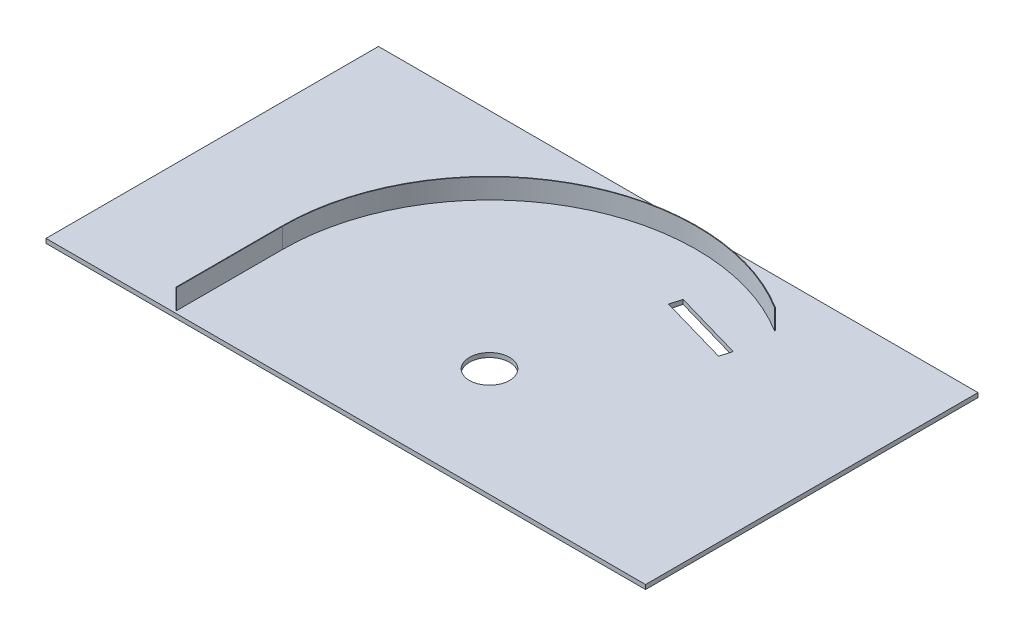
ISO-10303-21;
HEADER;
FILE_DESCRIPTION(('STEP AP214'),'2;1');
FILE_NAME('part.step','',(''),(''),'','','');
FILE_SCHEMA(('AUTOMOTIVE_DESIGN { 1 0 10303 214 1 1 1 1 }'));
ENDSEC;
DATA;
#1=APPLICATION_CONTEXT('core data for automotive mechanical design processes');
#2=APPLICATION_PROTOCOL_DEFINITION('international standard','automotive_design',2000,#1);
#3=PRODUCT_CONTEXT('',#1,'mechanical');
#4=PRODUCT('Part','Part','',(#3));
#5=PRODUCT_RELATED_PRODUCT_CATEGORY('part','',(#4));
#6=PRODUCT_DEFINITION_FORMATION('','',#4);
#7=PRODUCT_DEFINITION_CONTEXT('part definition',#1,'design');
#8=PRODUCT_DEFINITION('design','',#6,#7);
#9=PRODUCT_DEFINITION_SHAPE('','',#8);
#10=(LENGTH_UNIT() NAMED_UNIT(*) SI_UNIT(.MILLI.,.METRE.));
#11=(NAMED_UNIT(*) PLANE_ANGLE_UNIT() SI_UNIT($,.RADIAN.));
#12=(NAMED_UNIT(*) SI_UNIT($,.STERADIAN.) SOLID_ANGLE_UNIT());
#13=UNCERTAINTY_MEASURE_WITH_UNIT(LENGTH_MEASURE(1.E-05),#10,'distance_accuracy_value','');
#14=(GEOMETRIC_REPRESENTATION_CONTEXT(3) GLOBAL_UNCERTAINTY_ASSIGNED_CONTEXT((#13)) GLOBAL_UNIT_ASSIGNED_CONTEXT((#10,
#11,#12)) REPRESENTATION_CONTEXT('',''));
#15=CARTESIAN_POINT('',(0.,0.,0.));
#16=DIRECTION('',(0.,0.,1.));
#17=DIRECTION('',(1.,0.,0.));
#18=AXIS2_PLACEMENT_3D('',#15,#16,#17);
#19=CARTESIAN_POINT('',(0.,0.,0.));
#20=DIRECTION('',(0.,1.,0.));
#21=DIRECTION('',(0.,0.,1.));
#22=AXIS2_PLACEMENT_3D('',#19,#20,#21);
#23=PLANE('',#22);
#24=DIRECTION('',(0.275637355816992,0.,-0.961261695938321));
#25=VECTOR('',#24,1.);
#26=CARTESIAN_POINT('',(262.4,0.,-317.9));
#27=LINE('',#26,#25);
#28=CARTESIAN_POINT('',(262.4,0.,-317.9));
#29=VERTEX_POINT('',#28);
#30=CARTESIAN_POINT('',(270.66912067451,0.,-346.737850878149));
#31=VERTEX_POINT('',#30);
#32=EDGE_CURVE('E57',#29,#31,#27,.T.);
#33=ORIENTED_EDGE('',*,*,#32,.F.);
#34=DIRECTION('',(0.961261695938321,0.,0.275637355816993));
#35=VECTOR('',#34,1.);
#36=CARTESIAN_POINT('',(84.5665862514106,0.,-368.892910826144));
#37=LINE('',#36,#35);
#38=CARTESIAN_POINT('',(84.5665862514106,0.,-368.892910826144));
#39=VERTEX_POINT('',#38);
#40=EDGE_CURVE('E161',#39,#29,#37,.T.);
#41=ORIENTED_EDGE('',*,*,#40,.F.);
#42=DIRECTION('',(-0.275637355816993,0.,0.961261695938321));
#43=VECTOR('',#42,1.);
#44=CARTESIAN_POINT('',(92.8357069259204,0.,-397.730761704293));
#45=LINE('',#44,#43);
#46=CARTESIAN_POINT('',(92.8357069259204,0.,-397.730761704293));
#47=VERTEX_POINT('',#46);
#48=EDGE_CURVE('E164',#47,#39,#45,.T.);
#49=ORIENTED_EDGE('',*,*,#48,.F.);
#50=DIRECTION('',(-0.961261695938321,0.,-0.275637355816993));
#51=VECTOR('',#50,1.);
#52=CARTESIAN_POINT('',(270.66912067451,0.,-346.73785087815));
#53=LINE('',#52,#51);
#54=EDGE_CURVE('E170',#31,#47,#53,.T.);
#55=ORIENTED_EDGE('',*,*,#54,.F.);
#56=EDGE_LOOP('',(#33,#41,#49,#55));
#57=FACE_BOUND('',#56,.T.);
#58=CARTESIAN_POINT('',(0.,0.,0.));
#59=DIRECTION('',(0.,1.,0.));
#60=DIRECTION('',(0.,0.,1.));
#61=AXIS2_PLACEMENT_3D('',#58,#59,#60);
#62=CIRCLE('',#61,50.8);
#63=CARTESIAN_POINT('',(0.,0.,50.8));
#64=VERTEX_POINT('',#63);
#65=EDGE_CURVE('E183',#64,#64,#62,.T.);
#66=ORIENTED_EDGE('',*,*,#65,.F.);
#67=EDGE_LOOP('',(#66));
#68=FACE_BOUND('',#67,.T.);
#69=DIRECTION('',(0.,0.,1.));
#70=VECTOR('',#69,1.);
#71=CARTESIAN_POINT('',(-848.,0.,-566.7));
#72=LINE('',#71,#70);
#73=CARTESIAN_POINT('',(-848.,0.,-566.7));
#74=VERTEX_POINT('',#73);
#75=CARTESIAN_POINT('',(-848.,0.,275.4));
#76=VERTEX_POINT('',#75);
#77=EDGE_CURVE('E208',#74,#76,#72,.T.);
#78=ORIENTED_EDGE('',*,*,#77,.T.);
#79=DIRECTION('',(1.,0.,0.));
#80=VECTOR('',#79,1.);
#81=CARTESIAN_POINT('',(-848.,0.,275.4));
#82=LINE('',#81,#80);
#83=CARTESIAN_POINT('',(670.677694458201,0.,275.4));
#84=VERTEX_POINT('',#83);
#85=EDGE_CURVE('E225',#76,#84,#82,.T.);
#86=ORIENTED_EDGE('',*,*,#85,.T.);
#87=DIRECTION('',(0.,0.,-1.));
#88=VECTOR('',#87,1.);
#89=CARTESIAN_POINT('',(670.677694458201,0.,-566.7));
#90=LINE('',#89,#88);
#91=CARTESIAN_POINT('',(670.677694458201,0.,-566.7));
#92=VERTEX_POINT('',#91);
#93=EDGE_CURVE('E228',#84,#92,#90,.T.);
#94=ORIENTED_EDGE('',*,*,#93,.T.);
#95=DIRECTION('',(-1.,0.,0.));
#96=VECTOR('',#95,1.);
#97=CARTESIAN_POINT('',(-848.,0.,-566.7));
#98=LINE('',#97,#96);
#99=EDGE_CURVE('E213',#92,#74,#98,.T.);
#100=ORIENTED_EDGE('',*,*,#99,.T.);
#101=EDGE_LOOP('',(#78,#86,#94,#100));
#102=FACE_BOUND('',#101,.T.);
#103=DIRECTION('',(1.,0.,0.));
#104=VECTOR('',#103,1.);
#105=CARTESIAN_POINT('',(-525.5875,0.,269.05));
#106=LINE('',#105,#104);
#107=CARTESIAN_POINT('',(-525.5875,0.,269.05));
#108=VERTEX_POINT('',#107);
#109=CARTESIAN_POINT('',(-524.,0.,269.05));
#110=VERTEX_POINT('',#109);
#111=EDGE_CURVE('E184',#108,#110,#106,.T.);
#112=ORIENTED_EDGE('',*,*,#111,.F.);
#113=DIRECTION('',(0.,0.,-1.));
#114=VECTOR('',#113,1.);
#115=CARTESIAN_POINT('',(-525.5875,0.,319.874798634623));
#116=LINE('',#115,#114);
#117=CARTESIAN_POINT('',(-525.5875,0.,0.));
#118=VERTEX_POINT('',#117);
#119=EDGE_CURVE('E194',#108,#118,#116,.T.);
#120=ORIENTED_EDGE('',*,*,#119,.T.);
#121=CARTESIAN_POINT('',(0.,0.,0.));
#122=DIRECTION('',(0.,1.,0.));
#123=DIRECTION('',(0.,0.,1.));
#124=AXIS2_PLACEMENT_3D('',#121,#122,#123);
#125=CIRCLE('',#124,525.5875);
#126=CARTESIAN_POINT('',(277.677694458201,0.,-446.248045549365));
#127=VERTEX_POINT('',#126);
#128=EDGE_CURVE('E245',#127,#118,#125,.T.);
#129=ORIENTED_EDGE('',*,*,#128,.F.);
#130=DIRECTION('',(0.,0.,-1.));
#131=VECTOR('',#130,1.);
#132=CARTESIAN_POINT('',(277.677694458201,0.,-444.377202385966));
#133=LINE('',#132,#131);
#134=CARTESIAN_POINT('',(277.677694458201,0.,-444.377202385966));
#135=VERTEX_POINT('',#134);
#136=EDGE_CURVE('E252',#135,#127,#133,.T.);
#137=ORIENTED_EDGE('',*,*,#136,.F.);
#138=CARTESIAN_POINT('',(0.,0.,0.));
#139=DIRECTION('',(0.,-1.,0.));
#140=DIRECTION('',(0.,0.,1.));
#141=AXIS2_PLACEMENT_3D('',#138,#139,#140);
#142=CIRCLE('',#141,524.);
#143=CARTESIAN_POINT('',(-524.,0.,0.));
#144=VERTEX_POINT('',#143);
#145=EDGE_CURVE('E235',#144,#135,#142,.T.);
#146=ORIENTED_EDGE('',*,*,#145,.F.);
#147=DIRECTION('',(0.,0.,-1.));
#148=VECTOR('',#147,1.);
#149=CARTESIAN_POINT('',(-524.,0.,319.874798634623));
#150=LINE('',#149,#148);
#151=EDGE_CURVE('E196',#110,#144,#150,.T.);
#152=ORIENTED_EDGE('',*,*,#151,.F.);
#153=EDGE_LOOP('',(#112,#120,#129,#137,#146,#152));
#154=FACE_BOUND('',#153,.T.);
#155=ADVANCED_FACE('F42',(#57,#68,#102,#154),#23,.T.);
#156=CARTESIAN_POINT('',(0.,50.8,0.));
#157=DIRECTION('',(0.,-1.,0.));
#158=DIRECTION('',(0.,0.,-1.));
#159=AXIS2_PLACEMENT_3D('',#156,#157,#158);
#160=CYLINDRICAL_SURFACE('',#159,524.);
#161=ORIENTED_EDGE('',*,*,#145,.T.);
#162=DIRECTION('',(0.,-1.,0.));
#163=VECTOR('',#162,1.);
#164=CARTESIAN_POINT('',(277.677694458201,50.8,-444.377202385966));
#165=LINE('',#164,#163);
#166=CARTESIAN_POINT('',(277.677694458201,50.8,-444.377202385966));
#167=VERTEX_POINT('',#166);
#168=EDGE_CURVE('E11',#167,#135,#165,.T.);
#169=ORIENTED_EDGE('',*,*,#168,.F.);
#170=CARTESIAN_POINT('',(0.,50.8,0.));
#171=DIRECTION('',(0.,-1.,0.));
#172=DIRECTION('',(0.,0.,1.));
#173=AXIS2_PLACEMENT_3D('',#170,#171,#172);
#174=CIRCLE('',#173,524.);
#175=CARTESIAN_POINT('',(-524.,50.8,0.));
#176=VERTEX_POINT('',#175);
#177=EDGE_CURVE('E241',#176,#167,#174,.T.);
#178=ORIENTED_EDGE('',*,*,#177,.F.);
#179=DIRECTION('',(0.,-1.,0.));
#180=VECTOR('',#179,1.);
#181=CARTESIAN_POINT('',(-524.,50.8,0.));
#182=LINE('',#181,#180);
#183=EDGE_CURVE('E249',#176,#144,#182,.T.);
#184=ORIENTED_EDGE('',*,*,#183,.T.);
#185=EDGE_LOOP('',(#161,#169,#178,#184));
#186=FACE_BOUND('',#185,.T.);
#187=ADVANCED_FACE('F44',(#186),#160,.F.);
#188=CARTESIAN_POINT('',(277.677694458201,50.8,-444.377202385966));
#189=DIRECTION('',(-1.,0.,0.));
#190=DIRECTION('',(0.,0.,1.));
#191=AXIS2_PLACEMENT_3D('',#188,#189,#190);
#192=PLANE('',#191);
#193=ORIENTED_EDGE('',*,*,#136,.T.);
#194=DIRECTION('',(0.,-1.,0.));
#195=VECTOR('',#194,1.);
#196=CARTESIAN_POINT('',(277.677694458201,50.8,-446.248045549365));
#197=LINE('',#196,#195);
#198=CARTESIAN_POINT('',(277.677694458201,50.8,-446.248045549365));
#199=VERTEX_POINT('',#198);
#200=EDGE_CURVE('E50',#199,#127,#197,.T.);
#201=ORIENTED_EDGE('',*,*,#200,.F.);
#202=DIRECTION('',(0.,0.,-1.));
#203=VECTOR('',#202,1.);
#204=CARTESIAN_POINT('',(277.677694458201,50.8,-444.377202385966));
#205=LINE('',#204,#203);
#206=EDGE_CURVE('E244',#167,#199,#205,.T.);
#207=ORIENTED_EDGE('',*,*,#206,.F.);
#208=ORIENTED_EDGE('',*,*,#168,.T.);
#209=EDGE_LOOP('',(#193,#201,#207,#208));
#210=FACE_BOUND('',#209,.T.);
#211=ADVANCED_FACE('F268',(#210),#192,.F.);
#212=CARTESIAN_POINT('',(0.,50.8,0.));
#213=DIRECTION('',(0.,-1.,0.));
#214=DIRECTION('',(0.,0.,-1.));
#215=AXIS2_PLACEMENT_3D('',#212,#213,#214);
#216=CYLINDRICAL_SURFACE('',#215,525.5875);
#217=ORIENTED_EDGE('',*,*,#128,.T.);
#218=DIRECTION('',(0.,-1.,0.));
#219=VECTOR('',#218,1.);
#220=CARTESIAN_POINT('',(-525.5875,50.8,0.));
#221=LINE('',#220,#219);
#222=CARTESIAN_POINT('',(-525.5875,50.8,0.));
#223=VERTEX_POINT('',#222);
#224=EDGE_CURVE('E259',#223,#118,#221,.T.);
#225=ORIENTED_EDGE('',*,*,#224,.F.);
#226=CARTESIAN_POINT('',(0.,50.8,0.));
#227=DIRECTION('',(0.,1.,0.));
#228=DIRECTION('',(0.,0.,1.));
#229=AXIS2_PLACEMENT_3D('',#226,#227,#228);
#230=CIRCLE('',#229,525.5875);
#231=EDGE_CURVE('E247',#199,#223,#230,.T.);
#232=ORIENTED_EDGE('',*,*,#231,.F.);
#233=ORIENTED_EDGE('',*,*,#200,.T.);
#234=EDGE_LOOP('',(#217,#225,#232,#233));
#235=FACE_BOUND('',#234,.T.);
#236=ADVANCED_FACE('F265',(#235),#216,.T.);
#237=CARTESIAN_POINT('',(0.,50.8,0.));
#238=DIRECTION('',(0.,1.,0.));
#239=DIRECTION('',(0.,0.,1.));
#240=AXIS2_PLACEMENT_3D('',#237,#238,#239);
#241=PLANE('',#240);
#242=ORIENTED_EDGE('',*,*,#177,.T.);
#243=ORIENTED_EDGE('',*,*,#206,.T.);
#244=ORIENTED_EDGE('',*,*,#231,.T.);
#245=DIRECTION('',(0.,0.,-1.));
#246=VECTOR('',#245,1.);
#247=CARTESIAN_POINT('',(-525.5875,50.8,319.874798634623));
#248=LINE('',#247,#246);
#249=CARTESIAN_POINT('',(-525.5875,50.8,269.05));
#250=VERTEX_POINT('',#249);
#251=EDGE_CURVE('E176',#250,#223,#248,.T.);
#252=ORIENTED_EDGE('',*,*,#251,.F.);
#253=DIRECTION('',(-1.,0.,0.));
#254=VECTOR('',#253,1.);
#255=CARTESIAN_POINT('',(-525.5875,50.8,269.05));
#256=LINE('',#255,#254);
#257=CARTESIAN_POINT('',(-524.,50.8,269.05));
#258=VERTEX_POINT('',#257);
#259=EDGE_CURVE('E190',#258,#250,#256,.T.);
#260=ORIENTED_EDGE('',*,*,#259,.F.);
#261=DIRECTION('',(0.,0.,-1.));
#262=VECTOR('',#261,1.);
#263=CARTESIAN_POINT('',(-524.,50.8,319.874798634623));
#264=LINE('',#263,#262);
#265=EDGE_CURVE('E193',#258,#176,#264,.T.);
#266=ORIENTED_EDGE('',*,*,#265,.T.);
#267=EDGE_LOOP('',(#242,#243,#244,#252,#260,#266));
#268=FACE_BOUND('',#267,.T.);
#269=ADVANCED_FACE('F280',(#268),#241,.T.);
#270=CARTESIAN_POINT('',(-848.,-11.1125,-566.7));
#271=DIRECTION('',(-1.,0.,0.));
#272=DIRECTION('',(0.,0.,1.));
#273=AXIS2_PLACEMENT_3D('',#270,#271,#272);
#274=PLANE('',#273);
#275=ORIENTED_EDGE('',*,*,#77,.F.);
#276=DIRECTION('',(0.,1.,0.));
#277=VECTOR('',#276,1.);
#278=CARTESIAN_POINT('',(-848.,-11.1125,-566.7));
#279=LINE('',#278,#277);
#280=CARTESIAN_POINT('',(-848.,-11.1125,-566.7));
#281=VERTEX_POINT('',#280);
#282=EDGE_CURVE('E233',#281,#74,#279,.T.);
#283=ORIENTED_EDGE('',*,*,#282,.F.);
#284=DIRECTION('',(0.,0.,1.));
#285=VECTOR('',#284,1.);
#286=CARTESIAN_POINT('',(-848.,-11.1125,-566.7));
#287=LINE('',#286,#285);
#288=CARTESIAN_POINT('',(-848.,-11.1125,275.4));
#289=VERTEX_POINT('',#288);
#290=EDGE_CURVE('E209',#281,#289,#287,.T.);
#291=ORIENTED_EDGE('',*,*,#290,.T.);
#292=DIRECTION('',(0.,1.,0.));
#293=VECTOR('',#292,1.);
#294=CARTESIAN_POINT('',(-848.,-11.1125,275.4));
#295=LINE('',#294,#293);
#296=EDGE_CURVE('E222',#289,#76,#295,.T.);
#297=ORIENTED_EDGE('',*,*,#296,.T.);
#298=EDGE_LOOP('',(#275,#283,#291,#297));
#299=FACE_BOUND('',#298,.T.);
#300=ADVANCED_FACE('F310',(#299),#274,.T.);
#301=CARTESIAN_POINT('',(-848.,-11.1125,-566.7));
#302=DIRECTION('',(0.,0.,-1.));
#303=DIRECTION('',(-1.,0.,0.));
#304=AXIS2_PLACEMENT_3D('',#301,#302,#303);
#305=PLANE('',#304);
#306=ORIENTED_EDGE('',*,*,#99,.F.);
#307=DIRECTION('',(0.,1.,0.));
#308=VECTOR('',#307,1.);
#309=CARTESIAN_POINT('',(670.677694458201,-11.1125,-566.7));
#310=LINE('',#309,#308);
#311=CARTESIAN_POINT('',(670.677694458201,-11.1125,-566.7));
#312=VERTEX_POINT('',#311);
#313=EDGE_CURVE('E236',#312,#92,#310,.T.);
#314=ORIENTED_EDGE('',*,*,#313,.F.);
#315=DIRECTION('',(-1.,0.,0.));
#316=VECTOR('',#315,1.);
#317=CARTESIAN_POINT('',(-848.,-11.1125,-566.7));
#318=LINE('',#317,#316);
#319=EDGE_CURVE('E219',#312,#281,#318,.T.);
#320=ORIENTED_EDGE('',*,*,#319,.T.);
#321=ORIENTED_EDGE('',*,*,#282,.T.);
#322=EDGE_LOOP('',(#306,#314,#320,#321));
#323=FACE_BOUND('',#322,.T.);
#324=ADVANCED_FACE('F306',(#323),#305,.T.);
#325=CARTESIAN_POINT('',(670.677694458201,-11.1125,-566.7));
#326=DIRECTION('',(1.,0.,0.));
#327=DIRECTION('',(0.,0.,-1.));
#328=AXIS2_PLACEMENT_3D('',#325,#326,#327);
#329=PLANE('',#328);
#330=ORIENTED_EDGE('',*,*,#93,.F.);
#331=DIRECTION('',(0.,1.,0.));
#332=VECTOR('',#331,1.);
#333=CARTESIAN_POINT('',(670.677694458201,-11.1125,275.4));
#334=LINE('',#333,#332);
#335=CARTESIAN_POINT('',(670.677694458201,-11.1125,275.4));
#336=VERTEX_POINT('',#335);
#337=EDGE_CURVE('E238',#336,#84,#334,.T.);
#338=ORIENTED_EDGE('',*,*,#337,.F.);
#339=DIRECTION('',(0.,0.,-1.));
#340=VECTOR('',#339,1.);
#341=CARTESIAN_POINT('',(670.677694458201,-11.1125,-566.7));
#342=LINE('',#341,#340);
#343=EDGE_CURVE('E216',#336,#312,#342,.T.);
#344=ORIENTED_EDGE('',*,*,#343,.T.);
#345=ORIENTED_EDGE('',*,*,#313,.T.);
#346=EDGE_LOOP('',(#330,#338,#344,#345));
#347=FACE_BOUND('',#346,.T.);
#348=ADVANCED_FACE('F309',(#347),#329,.T.);
#349=CARTESIAN_POINT('',(-848.,-11.1125,275.4));
#350=DIRECTION('',(0.,0.,1.));
#351=DIRECTION('',(1.,0.,0.));
#352=AXIS2_PLACEMENT_3D('',#349,#350,#351);
#353=PLANE('',#352);
#354=ORIENTED_EDGE('',*,*,#85,.F.);
#355=ORIENTED_EDGE('',*,*,#296,.F.);
#356=DIRECTION('',(1.,0.,0.));
#357=VECTOR('',#356,1.);
#358=CARTESIAN_POINT('',(-848.,-11.1125,275.4));
#359=LINE('',#358,#357);
#360=EDGE_CURVE('E212',#289,#336,#359,.T.);
#361=ORIENTED_EDGE('',*,*,#360,.T.);
#362=ORIENTED_EDGE('',*,*,#337,.T.);
#363=EDGE_LOOP('',(#354,#355,#361,#362));
#364=FACE_BOUND('',#363,.T.);
#365=ADVANCED_FACE('F314',(#364),#353,.T.);
#366=CARTESIAN_POINT('',(0.,-11.1125,0.));
#367=DIRECTION('',(0.,1.,0.));
#368=DIRECTION('',(0.,0.,1.));
#369=AXIS2_PLACEMENT_3D('',#366,#367,#368);
#370=PLANE('',#369);
#371=DIRECTION('',(0.961261695938321,0.,0.275637355816993));
#372=VECTOR('',#371,1.);
#373=CARTESIAN_POINT('',(84.5665862514106,-11.1125,-368.892910826144));
#374=LINE('',#373,#372);
#375=CARTESIAN_POINT('',(84.5665862514106,-11.1125,-368.892910826144));
#376=VERTEX_POINT('',#375);
#377=CARTESIAN_POINT('',(262.4,-11.1125,-317.9));
#378=VERTEX_POINT('',#377);
#379=EDGE_CURVE('E151',#376,#378,#374,.T.);
#380=ORIENTED_EDGE('',*,*,#379,.T.);
#381=DIRECTION('',(0.275637355816992,0.,-0.961261695938321));
#382=VECTOR('',#381,1.);
#383=CARTESIAN_POINT('',(262.4,-11.1125,-317.9));
#384=LINE('',#383,#382);
#385=CARTESIAN_POINT('',(270.66912067451,-11.1125,-346.73785087815));
#386=VERTEX_POINT('',#385);
#387=EDGE_CURVE('E145',#378,#386,#384,.T.);
#388=ORIENTED_EDGE('',*,*,#387,.T.);
#389=DIRECTION('',(-0.961261695938321,0.,-0.275637355816993));
#390=VECTOR('',#389,1.);
#391=CARTESIAN_POINT('',(270.66912067451,-11.1125,-346.73785087815));
#392=LINE('',#391,#390);
#393=CARTESIAN_POINT('',(92.8357069259204,-11.1125,-397.730761704293));
#394=VERTEX_POINT('',#393);
#395=EDGE_CURVE('E154',#386,#394,#392,.T.);
#396=ORIENTED_EDGE('',*,*,#395,.T.);
#397=DIRECTION('',(-0.275637355816993,0.,0.961261695938321));
#398=VECTOR('',#397,1.);
#399=CARTESIAN_POINT('',(92.8357069259204,-11.1125,-397.730761704293));
#400=LINE('',#399,#398);
#401=EDGE_CURVE('E65',#394,#376,#400,.T.);
#402=ORIENTED_EDGE('',*,*,#401,.T.);
#403=EDGE_LOOP('',(#380,#388,#396,#402));
#404=FACE_BOUND('',#403,.T.);
#405=CARTESIAN_POINT('',(0.,-11.1125,0.));
#406=DIRECTION('',(0.,1.,0.));
#407=DIRECTION('',(0.,0.,1.));
#408=AXIS2_PLACEMENT_3D('',#405,#406,#407);
#409=CIRCLE('',#408,50.8);
#410=CARTESIAN_POINT('',(0.,-11.1125,50.8));
#411=VERTEX_POINT('',#410);
#412=EDGE_CURVE('E205',#411,#411,#409,.T.);
#413=ORIENTED_EDGE('',*,*,#412,.T.);
#414=EDGE_LOOP('',(#413));
#415=FACE_BOUND('',#414,.T.);
#416=ORIENTED_EDGE('',*,*,#290,.F.);
#417=ORIENTED_EDGE('',*,*,#319,.F.);
#418=ORIENTED_EDGE('',*,*,#343,.F.);
#419=ORIENTED_EDGE('',*,*,#360,.F.);
#420=EDGE_LOOP('',(#416,#417,#418,#419));
#421=FACE_BOUND('',#420,.T.);
#422=ADVANCED_FACE('F158',(#404,#415,#421),#370,.F.);
#423=CARTESIAN_POINT('',(0.,0.,0.));
#424=DIRECTION('',(0.,1.,0.));
#425=DIRECTION('',(0.,0.,1.));
#426=AXIS2_PLACEMENT_3D('',#423,#424,#425);
#427=CYLINDRICAL_SURFACE('',#426,50.8);
#428=ORIENTED_EDGE('',*,*,#412,.F.);
#429=EDGE_LOOP('',(#428));
#430=FACE_BOUND('',#429,.T.);
#431=ORIENTED_EDGE('',*,*,#65,.T.);
#432=EDGE_LOOP('',(#431));
#433=FACE_BOUND('',#432,.T.);
#434=ADVANCED_FACE('F292',(#430,#433),#427,.F.);
#435=CARTESIAN_POINT('',(-525.5875,50.8,319.874798634623));
#436=DIRECTION('',(1.,0.,0.));
#437=DIRECTION('',(0.,0.,-1.));
#438=AXIS2_PLACEMENT_3D('',#435,#436,#437);
#439=PLANE('',#438);
#440=DIRECTION('',(0.,-1.,0.));
#441=VECTOR('',#440,1.);
#442=CARTESIAN_POINT('',(-525.5875,50.8,269.05));
#443=LINE('',#442,#441);
#444=EDGE_CURVE('E187',#250,#108,#443,.T.);
#445=ORIENTED_EDGE('',*,*,#444,.F.);
#446=ORIENTED_EDGE('',*,*,#251,.T.);
#447=ORIENTED_EDGE('',*,*,#224,.T.);
#448=ORIENTED_EDGE('',*,*,#119,.F.);
#449=EDGE_LOOP('',(#445,#446,#447,#448));
#450=FACE_BOUND('',#449,.T.);
#451=ADVANCED_FACE('F274',(#450),#439,.F.);
#452=CARTESIAN_POINT('',(-524.,50.8,319.874798634623));
#453=DIRECTION('',(-1.,0.,0.));
#454=DIRECTION('',(0.,0.,1.));
#455=AXIS2_PLACEMENT_3D('',#452,#453,#454);
#456=PLANE('',#455);
#457=DIRECTION('',(0.,1.,0.));
#458=VECTOR('',#457,1.);
#459=CARTESIAN_POINT('',(-524.,50.8,269.05));
#460=LINE('',#459,#458);
#461=EDGE_CURVE('E180',#110,#258,#460,.T.);
#462=ORIENTED_EDGE('',*,*,#461,.F.);
#463=ORIENTED_EDGE('',*,*,#151,.T.);
#464=ORIENTED_EDGE('',*,*,#183,.F.);
#465=ORIENTED_EDGE('',*,*,#265,.F.);
#466=EDGE_LOOP('',(#462,#463,#464,#465));
#467=FACE_BOUND('',#466,.T.);
#468=ADVANCED_FACE('F284',(#467),#456,.F.);
#469=CARTESIAN_POINT('',(0.,0.,269.05));
#470=DIRECTION('',(0.,0.,1.));
#471=DIRECTION('',(1.,0.,0.));
#472=AXIS2_PLACEMENT_3D('',#469,#470,#471);
#473=PLANE('',#472);
#474=ORIENTED_EDGE('',*,*,#259,.T.);
#475=ORIENTED_EDGE('',*,*,#444,.T.);
#476=ORIENTED_EDGE('',*,*,#111,.T.);
#477=ORIENTED_EDGE('',*,*,#461,.T.);
#478=EDGE_LOOP('',(#474,#475,#476,#477));
#479=FACE_BOUND('',#478,.T.);
#480=ADVANCED_FACE('F276',(#479),#473,.T.);
#481=CARTESIAN_POINT('',(262.4,-11.1125,-317.9));
#482=DIRECTION('',(0.961261695938321,0.,0.275637355816992));
#483=DIRECTION('',(0.275637355816992,0.,-0.961261695938321));
#484=AXIS2_PLACEMENT_3D('',#481,#482,#483);
#485=PLANE('',#484);
#486=ORIENTED_EDGE('',*,*,#32,.T.);
#487=DIRECTION('',(0.,1.,0.));
#488=VECTOR('',#487,1.);
#489=CARTESIAN_POINT('',(270.66912067451,-11.1125,-346.73785087815));
#490=LINE('',#489,#488);
#491=EDGE_CURVE('E141',#386,#31,#490,.T.);
#492=ORIENTED_EDGE('',*,*,#491,.F.);
#493=ORIENTED_EDGE('',*,*,#387,.F.);
#494=DIRECTION('',(0.,1.,0.));
#495=VECTOR('',#494,1.);
#496=CARTESIAN_POINT('',(262.4,-11.1125,-317.9));
#497=LINE('',#496,#495);
#498=EDGE_CURVE('E174',#378,#29,#497,.T.);
#499=ORIENTED_EDGE('',*,*,#498,.T.);
#500=EDGE_LOOP('',(#486,#492,#493,#499));
#501=FACE_BOUND('',#500,.T.);
#502=ADVANCED_FACE('F143',(#501),#485,.F.);
#503=CARTESIAN_POINT('',(84.5665862514106,-11.1125,-368.892910826144));
#504=DIRECTION('',(-0.275637355816993,0.,0.961261695938321));
#505=DIRECTION('',(0.961261695938321,0.,0.275637355816993));
#506=AXIS2_PLACEMENT_3D('',#503,#504,#505);
#507=PLANE('',#506);
#508=ORIENTED_EDGE('',*,*,#40,.T.);
#509=ORIENTED_EDGE('',*,*,#498,.F.);
#510=ORIENTED_EDGE('',*,*,#379,.F.);
#511=DIRECTION('',(0.,1.,0.));
#512=VECTOR('',#511,1.);
#513=CARTESIAN_POINT('',(84.5665862514106,-11.1125,-368.892910826144));
#514=LINE('',#513,#512);
#515=EDGE_CURVE('E177',#376,#39,#514,.T.);
#516=ORIENTED_EDGE('',*,*,#515,.T.);
#517=EDGE_LOOP('',(#508,#509,#510,#516));
#518=FACE_BOUND('',#517,.T.);
#519=ADVANCED_FACE('F397',(#518),#507,.F.);
#520=CARTESIAN_POINT('',(92.8357069259204,-11.1125,-397.730761704293));
#521=DIRECTION('',(-0.961261695938321,0.,-0.275637355816993));
#522=DIRECTION('',(-0.275637355816993,0.,0.961261695938321));
#523=AXIS2_PLACEMENT_3D('',#520,#521,#522);
#524=PLANE('',#523);
#525=ORIENTED_EDGE('',*,*,#48,.T.);
#526=ORIENTED_EDGE('',*,*,#515,.F.);
#527=ORIENTED_EDGE('',*,*,#401,.F.);
#528=DIRECTION('',(0.,1.,0.));
#529=VECTOR('',#528,1.);
#530=CARTESIAN_POINT('',(92.8357069259204,-11.1125,-397.730761704293));
#531=LINE('',#530,#529);
#532=EDGE_CURVE('E150',#394,#47,#531,.T.);
#533=ORIENTED_EDGE('',*,*,#532,.T.);
#534=EDGE_LOOP('',(#525,#526,#527,#533));
#535=FACE_BOUND('',#534,.T.);
#536=ADVANCED_FACE('F405',(#535),#524,.F.);
#537=CARTESIAN_POINT('',(270.66912067451,-11.1125,-346.73785087815));
#538=DIRECTION('',(0.275637355816993,0.,-0.961261695938321));
#539=DIRECTION('',(-0.961261695938321,0.,-0.275637355816993));
#540=AXIS2_PLACEMENT_3D('',#537,#538,#539);
#541=PLANE('',#540);
#542=ORIENTED_EDGE('',*,*,#54,.T.);
#543=ORIENTED_EDGE('',*,*,#532,.F.);
#544=ORIENTED_EDGE('',*,*,#395,.F.);
#545=ORIENTED_EDGE('',*,*,#491,.T.);
#546=EDGE_LOOP('',(#542,#543,#544,#545));
#547=FACE_BOUND('',#546,.T.);
#548=ADVANCED_FACE('F155',(#547),#541,.F.);
#549=CLOSED_SHELL('',(#155,#187,#211,#236,#269,#300,#324,#348,#365,#422,#434,#451,#468,#480,
#502,#519,#536,#548));
#550=MANIFOLD_SOLID_BREP('B2',#549);
#551=ADVANCED_BREP_SHAPE_REPRESENTATION('',(#18,#550),#14);
#552=SHAPE_DEFINITION_REPRESENTATION(#9,#551);
ENDSEC;
END-ISO-10303-21;
